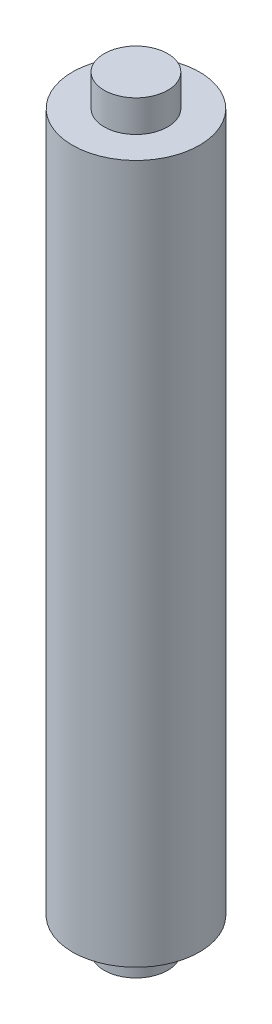
ISO-10303-21;
HEADER;
FILE_DESCRIPTION(('STEP AP214'),'2;1');
FILE_NAME('part.step','',(''),(''),'','','');
FILE_SCHEMA(('AUTOMOTIVE_DESIGN { 1 0 10303 214 1 1 1 1 }'));
ENDSEC;
DATA;
#1=APPLICATION_CONTEXT('core data for automotive mechanical design processes');
#2=APPLICATION_PROTOCOL_DEFINITION('international standard','automotive_design',2000,#1);
#3=PRODUCT_CONTEXT('',#1,'mechanical');
#4=PRODUCT('Part','Part','',(#3));
#5=PRODUCT_RELATED_PRODUCT_CATEGORY('part','',(#4));
#6=PRODUCT_DEFINITION_FORMATION('','',#4);
#7=PRODUCT_DEFINITION_CONTEXT('part definition',#1,'design');
#8=PRODUCT_DEFINITION('design','',#6,#7);
#9=PRODUCT_DEFINITION_SHAPE('','',#8);
#10=(LENGTH_UNIT() NAMED_UNIT(*) SI_UNIT(.MILLI.,.METRE.));
#11=(NAMED_UNIT(*) PLANE_ANGLE_UNIT() SI_UNIT($,.RADIAN.));
#12=(NAMED_UNIT(*) SI_UNIT($,.STERADIAN.) SOLID_ANGLE_UNIT());
#13=UNCERTAINTY_MEASURE_WITH_UNIT(LENGTH_MEASURE(1.E-05),#10,'distance_accuracy_value','');
#14=(GEOMETRIC_REPRESENTATION_CONTEXT(3) GLOBAL_UNCERTAINTY_ASSIGNED_CONTEXT((#13)) GLOBAL_UNIT_ASSIGNED_CONTEXT((#10,
#11,#12)) REPRESENTATION_CONTEXT('',''));
#15=CARTESIAN_POINT('',(0.,0.,0.));
#16=DIRECTION('',(0.,0.,1.));
#17=DIRECTION('',(1.,0.,0.));
#18=AXIS2_PLACEMENT_3D('',#15,#16,#17);
#19=CARTESIAN_POINT('',(0.,110.,0.));
#20=DIRECTION('',(0.,1.,0.));
#21=DIRECTION('',(0.,0.,1.));
#22=AXIS2_PLACEMENT_3D('',#19,#20,#21);
#23=PLANE('',#22);
#24=CARTESIAN_POINT('',(0.,110.,0.));
#25=DIRECTION('',(0.,1.,0.));
#26=DIRECTION('',(0.,0.,1.));
#27=AXIS2_PLACEMENT_3D('',#24,#25,#26);
#28=CIRCLE('',#27,10.);
#29=CARTESIAN_POINT('',(0.,110.,10.));
#30=VERTEX_POINT('',#29);
#31=EDGE_CURVE('E10',#30,#30,#28,.T.);
#32=ORIENTED_EDGE('',*,*,#31,.T.);
#33=EDGE_LOOP('',(#32));
#34=FACE_BOUND('',#33,.T.);
#35=CARTESIAN_POINT('',(0.,110.,0.));
#36=DIRECTION('',(0.,1.,0.));
#37=DIRECTION('',(0.,0.,1.));
#38=AXIS2_PLACEMENT_3D('',#35,#36,#37);
#39=CIRCLE('',#38,5.);
#40=CARTESIAN_POINT('',(0.,110.,5.));
#41=VERTEX_POINT('',#40);
#42=EDGE_CURVE('E44',#41,#41,#39,.T.);
#43=ORIENTED_EDGE('',*,*,#42,.F.);
#44=EDGE_LOOP('',(#43));
#45=FACE_BOUND('',#44,.T.);
#46=ADVANCED_FACE('F33',(#34,#45),#23,.T.);
#47=CARTESIAN_POINT('',(0.,0.,0.));
#48=DIRECTION('',(0.,1.,0.));
#49=DIRECTION('',(0.,0.,1.));
#50=AXIS2_PLACEMENT_3D('',#47,#48,#49);
#51=PLANE('',#50);
#52=CARTESIAN_POINT('',(0.,0.,0.));
#53=DIRECTION('',(0.,1.,0.));
#54=DIRECTION('',(0.,0.,1.));
#55=AXIS2_PLACEMENT_3D('',#52,#53,#54);
#56=CIRCLE('',#55,5.);
#57=CARTESIAN_POINT('',(0.,0.,5.));
#58=VERTEX_POINT('',#57);
#59=EDGE_CURVE('E52',#58,#58,#56,.T.);
#60=ORIENTED_EDGE('',*,*,#59,.T.);
#61=EDGE_LOOP('',(#60));
#62=FACE_BOUND('',#61,.T.);
#63=CARTESIAN_POINT('',(0.,0.,0.));
#64=DIRECTION('',(0.,1.,0.));
#65=DIRECTION('',(0.,0.,1.));
#66=AXIS2_PLACEMENT_3D('',#63,#64,#65);
#67=CIRCLE('',#66,10.);
#68=CARTESIAN_POINT('',(0.,0.,10.));
#69=VERTEX_POINT('',#68);
#70=EDGE_CURVE('E37',#69,#69,#67,.T.);
#71=ORIENTED_EDGE('',*,*,#70,.F.);
#72=EDGE_LOOP('',(#71));
#73=FACE_BOUND('',#72,.T.);
#74=ADVANCED_FACE('F70',(#62,#73),#51,.F.);
#75=CARTESIAN_POINT('',(0.,110.,0.));
#76=DIRECTION('',(0.,-1.,0.));
#77=DIRECTION('',(0.,0.,-1.));
#78=AXIS2_PLACEMENT_3D('',#75,#76,#77);
#79=CYLINDRICAL_SURFACE('',#78,10.);
#80=ORIENTED_EDGE('',*,*,#31,.F.);
#81=EDGE_LOOP('',(#80));
#82=FACE_BOUND('',#81,.T.);
#83=ORIENTED_EDGE('',*,*,#70,.T.);
#84=EDGE_LOOP('',(#83));
#85=FACE_BOUND('',#84,.T.);
#86=ADVANCED_FACE('F35',(#82,#85),#79,.T.);
#87=CARTESIAN_POINT('',(0.,115.,0.));
#88=DIRECTION('',(0.,-1.,0.));
#89=DIRECTION('',(0.,0.,-1.));
#90=AXIS2_PLACEMENT_3D('',#87,#88,#89);
#91=CYLINDRICAL_SURFACE('',#90,5.);
#92=ORIENTED_EDGE('',*,*,#42,.T.);
#93=EDGE_LOOP('',(#92));
#94=FACE_BOUND('',#93,.T.);
#95=CARTESIAN_POINT('',(0.,115.,0.));
#96=DIRECTION('',(0.,1.,0.));
#97=DIRECTION('',(0.,0.,1.));
#98=AXIS2_PLACEMENT_3D('',#95,#96,#97);
#99=CIRCLE('',#98,5.);
#100=CARTESIAN_POINT('',(0.,115.,5.));
#101=VERTEX_POINT('',#100);
#102=EDGE_CURVE('E48',#101,#101,#99,.T.);
#103=ORIENTED_EDGE('',*,*,#102,.F.);
#104=EDGE_LOOP('',(#103));
#105=FACE_BOUND('',#104,.T.);
#106=ADVANCED_FACE('F78',(#94,#105),#91,.T.);
#107=CARTESIAN_POINT('',(0.,115.,0.));
#108=DIRECTION('',(0.,1.,0.));
#109=DIRECTION('',(0.,0.,1.));
#110=AXIS2_PLACEMENT_3D('',#107,#108,#109);
#111=PLANE('',#110);
#112=ORIENTED_EDGE('',*,*,#102,.T.);
#113=EDGE_LOOP('',(#112));
#114=FACE_BOUND('',#113,.T.);
#115=ADVANCED_FACE('F67',(#114),#111,.T.);
#116=CARTESIAN_POINT('',(0.,-5.,0.));
#117=DIRECTION('',(0.,1.,0.));
#118=DIRECTION('',(0.,0.,1.));
#119=AXIS2_PLACEMENT_3D('',#116,#117,#118);
#120=CYLINDRICAL_SURFACE('',#119,5.);
#121=CARTESIAN_POINT('',(0.,-5.,0.));
#122=DIRECTION('',(0.,1.,0.));
#123=DIRECTION('',(0.,0.,1.));
#124=AXIS2_PLACEMENT_3D('',#121,#122,#123);
#125=CIRCLE('',#124,5.);
#126=CARTESIAN_POINT('',(0.,-5.,5.));
#127=VERTEX_POINT('',#126);
#128=EDGE_CURVE('E51',#127,#127,#125,.T.);
#129=ORIENTED_EDGE('',*,*,#128,.T.);
#130=EDGE_LOOP('',(#129));
#131=FACE_BOUND('',#130,.T.);
#132=ORIENTED_EDGE('',*,*,#59,.F.);
#133=EDGE_LOOP('',(#132));
#134=FACE_BOUND('',#133,.T.);
#135=ADVANCED_FACE('F58',(#131,#134),#120,.T.);
#136=CARTESIAN_POINT('',(0.,-5.,0.));
#137=DIRECTION('',(0.,1.,0.));
#138=DIRECTION('',(0.,0.,1.));
#139=AXIS2_PLACEMENT_3D('',#136,#137,#138);
#140=PLANE('',#139);
#141=ORIENTED_EDGE('',*,*,#128,.F.);
#142=EDGE_LOOP('',(#141));
#143=FACE_BOUND('',#142,.T.);
#144=ADVANCED_FACE('F61',(#143),#140,.F.);
#145=CLOSED_SHELL('',(#46,#74,#86,#106,#115,#135,#144));
#146=MANIFOLD_SOLID_BREP('B2',#145);
#147=ADVANCED_BREP_SHAPE_REPRESENTATION('',(#18,#146),#14);
#148=SHAPE_DEFINITION_REPRESENTATION(#9,#147);
ENDSEC;
END-ISO-10303-21;
